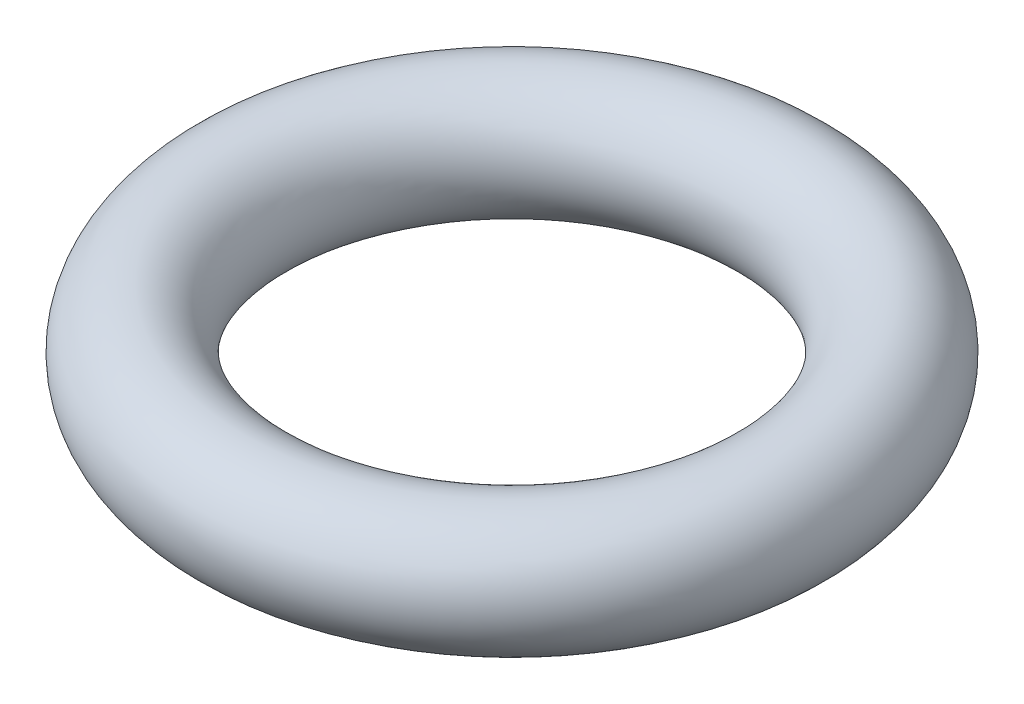
ISO-10303-21;
HEADER;
FILE_DESCRIPTION(('STEP AP214'),'2;1');
FILE_NAME('part.step','',(''),(''),'','','');
FILE_SCHEMA(('AUTOMOTIVE_DESIGN { 1 0 10303 214 1 1 1 1 }'));
ENDSEC;
DATA;
#1=APPLICATION_CONTEXT('core data for automotive mechanical design processes');
#2=APPLICATION_PROTOCOL_DEFINITION('international standard','automotive_design',2000,#1);
#3=PRODUCT_CONTEXT('',#1,'mechanical');
#4=PRODUCT('Part','Part','',(#3));
#5=PRODUCT_RELATED_PRODUCT_CATEGORY('part','',(#4));
#6=PRODUCT_DEFINITION_FORMATION('','',#4);
#7=PRODUCT_DEFINITION_CONTEXT('part definition',#1,'design');
#8=PRODUCT_DEFINITION('design','',#6,#7);
#9=PRODUCT_DEFINITION_SHAPE('','',#8);
#10=(LENGTH_UNIT() NAMED_UNIT(*) SI_UNIT(.MILLI.,.METRE.));
#11=(NAMED_UNIT(*) PLANE_ANGLE_UNIT() SI_UNIT($,.RADIAN.));
#12=(NAMED_UNIT(*) SI_UNIT($,.STERADIAN.) SOLID_ANGLE_UNIT());
#13=UNCERTAINTY_MEASURE_WITH_UNIT(LENGTH_MEASURE(1.E-05),#10,'distance_accuracy_value','');
#14=(GEOMETRIC_REPRESENTATION_CONTEXT(3) GLOBAL_UNCERTAINTY_ASSIGNED_CONTEXT((#13)) GLOBAL_UNIT_ASSIGNED_CONTEXT((#10,
#11,#12)) REPRESENTATION_CONTEXT('',''));
#15=CARTESIAN_POINT('',(0.,0.,0.));
#16=DIRECTION('',(0.,0.,1.));
#17=DIRECTION('',(1.,0.,0.));
#18=AXIS2_PLACEMENT_3D('',#15,#16,#17);
#19=CARTESIAN_POINT('',(0.,0.,0.));
#20=DIRECTION('',(0.,-1.,0.));
#21=DIRECTION('',(0.,0.,-1.));
#22=AXIS2_PLACEMENT_3D('',#19,#20,#21);
#23=TOROIDAL_SURFACE('',#22,3.925,0.890000000000007);
#24=CARTESIAN_POINT('',(0.,0.,-4.815));
#25=VERTEX_POINT('',#24);
#26=VERTEX_LOOP('',#25);
#27=FACE_BOUND('',#26,.T.);
#28=ADVANCED_FACE('F28',(#27),#23,.T.);
#29=CLOSED_SHELL('',(#28));
#30=MANIFOLD_SOLID_BREP('B2',#29);
#31=ADVANCED_BREP_SHAPE_REPRESENTATION('',(#18,#30),#14);
#32=SHAPE_DEFINITION_REPRESENTATION(#9,#31);
ENDSEC;
END-ISO-10303-21;
